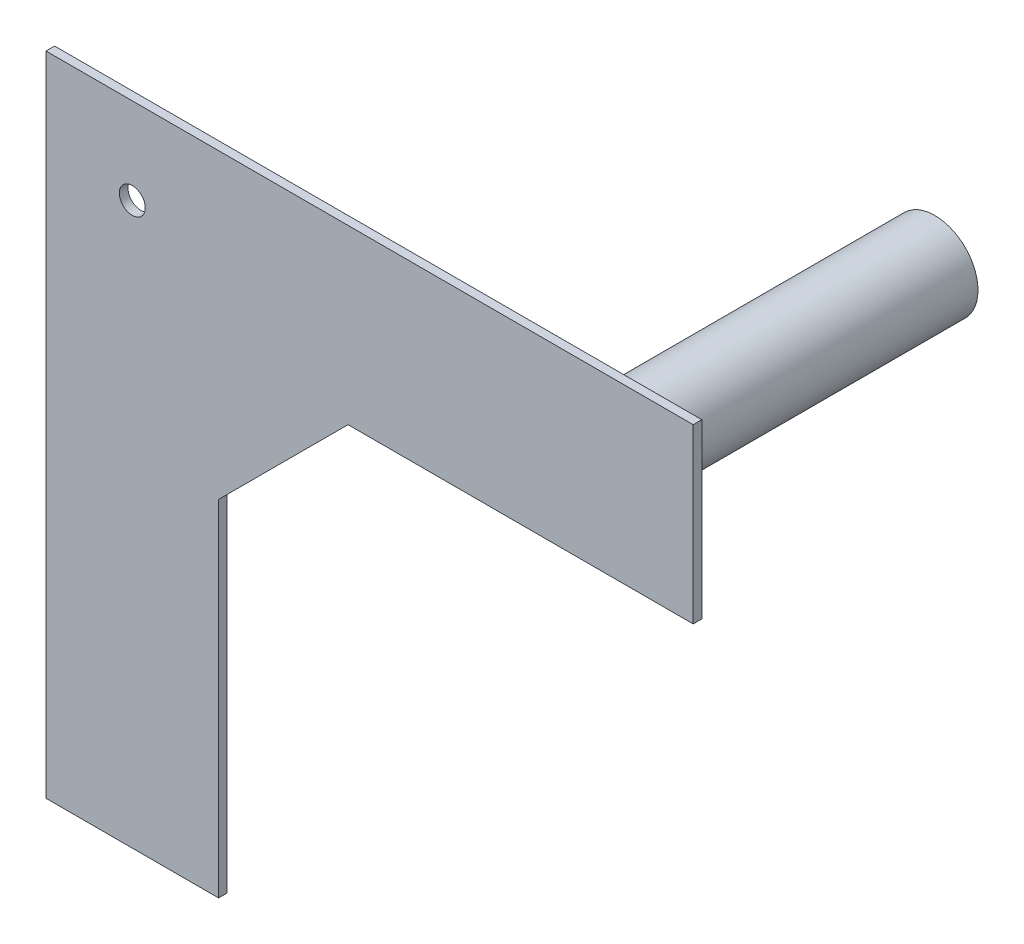
ISO-10303-21;
HEADER;
FILE_DESCRIPTION(('STEP AP214'),'2;1');
FILE_NAME('part.step','',(''),(''),'','','');
FILE_SCHEMA(('AUTOMOTIVE_DESIGN { 1 0 10303 214 1 1 1 1 }'));
ENDSEC;
DATA;
#1=APPLICATION_CONTEXT('core data for automotive mechanical design processes');
#2=APPLICATION_PROTOCOL_DEFINITION('international standard','automotive_design',2000,#1);
#3=PRODUCT_CONTEXT('',#1,'mechanical');
#4=PRODUCT('Part','Part','',(#3));
#5=PRODUCT_RELATED_PRODUCT_CATEGORY('part','',(#4));
#6=PRODUCT_DEFINITION_FORMATION('','',#4);
#7=PRODUCT_DEFINITION_CONTEXT('part definition',#1,'design');
#8=PRODUCT_DEFINITION('design','',#6,#7);
#9=PRODUCT_DEFINITION_SHAPE('','',#8);
#10=(LENGTH_UNIT() NAMED_UNIT(*) SI_UNIT(.MILLI.,.METRE.));
#11=(NAMED_UNIT(*) PLANE_ANGLE_UNIT() SI_UNIT($,.RADIAN.));
#12=(NAMED_UNIT(*) SI_UNIT($,.STERADIAN.) SOLID_ANGLE_UNIT());
#13=UNCERTAINTY_MEASURE_WITH_UNIT(LENGTH_MEASURE(1.E-05),#10,'distance_accuracy_value','');
#14=(GEOMETRIC_REPRESENTATION_CONTEXT(3) GLOBAL_UNCERTAINTY_ASSIGNED_CONTEXT((#13)) GLOBAL_UNIT_ASSIGNED_CONTEXT((#10,
#11,#12)) REPRESENTATION_CONTEXT('',''));
#15=CARTESIAN_POINT('',(0.,0.,0.));
#16=DIRECTION('',(0.,0.,1.));
#17=DIRECTION('',(1.,0.,0.));
#18=AXIS2_PLACEMENT_3D('',#15,#16,#17);
#19=CARTESIAN_POINT('',(-20.,35.,1.));
#20=DIRECTION('',(0.,-1.,0.));
#21=DIRECTION('',(1.,0.,0.));
#22=AXIS2_PLACEMENT_3D('',#19,#20,#21);
#23=PLANE('',#22);
#24=DIRECTION('',(-1.,0.,0.));
#25=VECTOR('',#24,1.);
#26=CARTESIAN_POINT('',(-20.,35.,0.));
#27=LINE('',#26,#25);
#28=CARTESIAN_POINT('',(55.,35.,0.));
#29=VERTEX_POINT('',#28);
#30=CARTESIAN_POINT('',(-20.,35.,0.));
#31=VERTEX_POINT('',#30);
#32=EDGE_CURVE('E124',#29,#31,#27,.T.);
#33=ORIENTED_EDGE('',*,*,#32,.T.);
#34=DIRECTION('',(0.,0.,-1.));
#35=VECTOR('',#34,1.);
#36=CARTESIAN_POINT('',(-20.,35.,1.));
#37=LINE('',#36,#35);
#38=CARTESIAN_POINT('',(-20.,35.,1.));
#39=VERTEX_POINT('',#38);
#40=EDGE_CURVE('E41',#39,#31,#37,.T.);
#41=ORIENTED_EDGE('',*,*,#40,.F.);
#42=DIRECTION('',(-1.,0.,0.));
#43=VECTOR('',#42,1.);
#44=CARTESIAN_POINT('',(-20.,35.,1.));
#45=LINE('',#44,#43);
#46=CARTESIAN_POINT('',(55.,35.,1.));
#47=VERTEX_POINT('',#46);
#48=EDGE_CURVE('E137',#47,#39,#45,.T.);
#49=ORIENTED_EDGE('',*,*,#48,.F.);
#50=DIRECTION('',(0.,0.,-1.));
#51=VECTOR('',#50,1.);
#52=CARTESIAN_POINT('',(55.,35.,1.));
#53=LINE('',#52,#51);
#54=EDGE_CURVE('E120',#47,#29,#53,.T.);
#55=ORIENTED_EDGE('',*,*,#54,.T.);
#56=EDGE_LOOP('',(#33,#41,#49,#55));
#57=FACE_BOUND('',#56,.T.);
#58=ADVANCED_FACE('F33',(#57),#23,.F.);
#59=CARTESIAN_POINT('',(-20.,35.,1.));
#60=DIRECTION('',(1.,0.,0.));
#61=DIRECTION('',(0.,1.,0.));
#62=AXIS2_PLACEMENT_3D('',#59,#60,#61);
#63=PLANE('',#62);
#64=DIRECTION('',(0.,-1.,0.));
#65=VECTOR('',#64,1.);
#66=CARTESIAN_POINT('',(-20.,35.,0.));
#67=LINE('',#66,#65);
#68=CARTESIAN_POINT('',(-20.,-40.,0.));
#69=VERTEX_POINT('',#68);
#70=EDGE_CURVE('E127',#31,#69,#67,.T.);
#71=ORIENTED_EDGE('',*,*,#70,.T.);
#72=DIRECTION('',(0.,0.,-1.));
#73=VECTOR('',#72,1.);
#74=CARTESIAN_POINT('',(-20.,-40.,1.));
#75=LINE('',#74,#73);
#76=CARTESIAN_POINT('',(-20.,-40.,1.));
#77=VERTEX_POINT('',#76);
#78=EDGE_CURVE('E144',#77,#69,#75,.T.);
#79=ORIENTED_EDGE('',*,*,#78,.F.);
#80=DIRECTION('',(0.,-1.,0.));
#81=VECTOR('',#80,1.);
#82=CARTESIAN_POINT('',(-20.,35.,1.));
#83=LINE('',#82,#81);
#84=EDGE_CURVE('E90',#39,#77,#83,.T.);
#85=ORIENTED_EDGE('',*,*,#84,.F.);
#86=ORIENTED_EDGE('',*,*,#40,.T.);
#87=EDGE_LOOP('',(#71,#79,#85,#86));
#88=FACE_BOUND('',#87,.T.);
#89=ADVANCED_FACE('F147',(#88),#63,.F.);
#90=CARTESIAN_POINT('',(-20.,-40.,1.));
#91=DIRECTION('',(0.,1.,0.));
#92=DIRECTION('',(0.,0.,1.));
#93=AXIS2_PLACEMENT_3D('',#90,#91,#92);
#94=PLANE('',#93);
#95=DIRECTION('',(1.,0.,0.));
#96=VECTOR('',#95,1.);
#97=CARTESIAN_POINT('',(-20.,-40.,0.));
#98=LINE('',#97,#96);
#99=CARTESIAN_POINT('',(0.,-40.,0.));
#100=VERTEX_POINT('',#99);
#101=EDGE_CURVE('E130',#69,#100,#98,.T.);
#102=ORIENTED_EDGE('',*,*,#101,.T.);
#103=DIRECTION('',(0.,0.,-1.));
#104=VECTOR('',#103,1.);
#105=CARTESIAN_POINT('',(0.,-40.,1.));
#106=LINE('',#105,#104);
#107=CARTESIAN_POINT('',(0.,-40.,1.));
#108=VERTEX_POINT('',#107);
#109=EDGE_CURVE('E141',#108,#100,#106,.T.);
#110=ORIENTED_EDGE('',*,*,#109,.F.);
#111=DIRECTION('',(1.,0.,0.));
#112=VECTOR('',#111,1.);
#113=CARTESIAN_POINT('',(-20.,-40.,1.));
#114=LINE('',#113,#112);
#115=EDGE_CURVE('E161',#77,#108,#114,.T.);
#116=ORIENTED_EDGE('',*,*,#115,.F.);
#117=ORIENTED_EDGE('',*,*,#78,.T.);
#118=EDGE_LOOP('',(#102,#110,#116,#117));
#119=FACE_BOUND('',#118,.T.);
#120=ADVANCED_FACE('F157',(#119),#94,.F.);
#121=CARTESIAN_POINT('',(0.,-40.,1.));
#122=DIRECTION('',(-1.,0.,0.));
#123=DIRECTION('',(0.,0.,1.));
#124=AXIS2_PLACEMENT_3D('',#121,#122,#123);
#125=PLANE('',#124);
#126=DIRECTION('',(0.,1.,0.));
#127=VECTOR('',#126,1.);
#128=CARTESIAN_POINT('',(0.,-40.,0.));
#129=LINE('',#128,#127);
#130=CARTESIAN_POINT('',(0.,0.,0.));
#131=VERTEX_POINT('',#130);
#132=EDGE_CURVE('E132',#100,#131,#129,.T.);
#133=ORIENTED_EDGE('',*,*,#132,.T.);
#134=DIRECTION('',(0.,0.,-1.));
#135=VECTOR('',#134,1.);
#136=CARTESIAN_POINT('',(0.,0.,1.));
#137=LINE('',#136,#135);
#138=CARTESIAN_POINT('',(0.,0.,1.));
#139=VERTEX_POINT('',#138);
#140=EDGE_CURVE('E115',#139,#131,#137,.T.);
#141=ORIENTED_EDGE('',*,*,#140,.F.);
#142=DIRECTION('',(0.,1.,0.));
#143=VECTOR('',#142,1.);
#144=CARTESIAN_POINT('',(0.,-40.,1.));
#145=LINE('',#144,#143);
#146=EDGE_CURVE('E106',#108,#139,#145,.T.);
#147=ORIENTED_EDGE('',*,*,#146,.F.);
#148=ORIENTED_EDGE('',*,*,#109,.T.);
#149=EDGE_LOOP('',(#133,#141,#147,#148));
#150=FACE_BOUND('',#149,.T.);
#151=ADVANCED_FACE('F160',(#150),#125,.F.);
#152=CARTESIAN_POINT('',(15.,15.,1.));
#153=DIRECTION('',(-0.707106781186548,0.707106781186547,0.));
#154=DIRECTION('',(-0.707106781186547,-0.707106781186548,0.));
#155=AXIS2_PLACEMENT_3D('',#152,#153,#154);
#156=PLANE('',#155);
#157=DIRECTION('',(0.707106781186547,0.707106781186548,0.));
#158=VECTOR('',#157,1.);
#159=CARTESIAN_POINT('',(15.,15.,0.));
#160=LINE('',#159,#158);
#161=CARTESIAN_POINT('',(15.,15.,0.));
#162=VERTEX_POINT('',#161);
#163=EDGE_CURVE('E114',#131,#162,#160,.T.);
#164=ORIENTED_EDGE('',*,*,#163,.T.);
#165=DIRECTION('',(0.,0.,-1.));
#166=VECTOR('',#165,1.);
#167=CARTESIAN_POINT('',(15.,15.,1.));
#168=LINE('',#167,#166);
#169=CARTESIAN_POINT('',(15.,15.,1.));
#170=VERTEX_POINT('',#169);
#171=EDGE_CURVE('E111',#170,#162,#168,.T.);
#172=ORIENTED_EDGE('',*,*,#171,.F.);
#173=DIRECTION('',(0.707106781186547,0.707106781186548,0.));
#174=VECTOR('',#173,1.);
#175=CARTESIAN_POINT('',(15.,15.,1.));
#176=LINE('',#175,#174);
#177=EDGE_CURVE('E100',#139,#170,#176,.T.);
#178=ORIENTED_EDGE('',*,*,#177,.F.);
#179=ORIENTED_EDGE('',*,*,#140,.T.);
#180=EDGE_LOOP('',(#164,#172,#178,#179));
#181=FACE_BOUND('',#180,.T.);
#182=ADVANCED_FACE('F112',(#181),#156,.F.);
#183=CARTESIAN_POINT('',(55.,15.,1.));
#184=DIRECTION('',(0.,1.,0.));
#185=DIRECTION('',(-1.,0.,0.));
#186=AXIS2_PLACEMENT_3D('',#183,#184,#185);
#187=PLANE('',#186);
#188=DIRECTION('',(1.,0.,0.));
#189=VECTOR('',#188,1.);
#190=CARTESIAN_POINT('',(55.,15.,0.));
#191=LINE('',#190,#189);
#192=CARTESIAN_POINT('',(55.,15.,0.));
#193=VERTEX_POINT('',#192);
#194=EDGE_CURVE('E75',#162,#193,#191,.T.);
#195=ORIENTED_EDGE('',*,*,#194,.T.);
#196=DIRECTION('',(0.,0.,-1.));
#197=VECTOR('',#196,1.);
#198=CARTESIAN_POINT('',(55.,15.,1.));
#199=LINE('',#198,#197);
#200=CARTESIAN_POINT('',(55.,15.,1.));
#201=VERTEX_POINT('',#200);
#202=EDGE_CURVE('E116',#201,#193,#199,.T.);
#203=ORIENTED_EDGE('',*,*,#202,.F.);
#204=DIRECTION('',(1.,0.,0.));
#205=VECTOR('',#204,1.);
#206=CARTESIAN_POINT('',(55.,15.,1.));
#207=LINE('',#206,#205);
#208=EDGE_CURVE('E104',#170,#201,#207,.T.);
#209=ORIENTED_EDGE('',*,*,#208,.F.);
#210=ORIENTED_EDGE('',*,*,#171,.T.);
#211=EDGE_LOOP('',(#195,#203,#209,#210));
#212=FACE_BOUND('',#211,.T.);
#213=ADVANCED_FACE('F118',(#212),#187,.F.);
#214=CARTESIAN_POINT('',(55.,35.,1.));
#215=DIRECTION('',(-1.,0.,0.));
#216=DIRECTION('',(0.,-1.,0.));
#217=AXIS2_PLACEMENT_3D('',#214,#215,#216);
#218=PLANE('',#217);
#219=DIRECTION('',(0.,1.,0.));
#220=VECTOR('',#219,1.);
#221=CARTESIAN_POINT('',(55.,35.,0.));
#222=LINE('',#221,#220);
#223=EDGE_CURVE('E81',#193,#29,#222,.T.);
#224=ORIENTED_EDGE('',*,*,#223,.T.);
#225=ORIENTED_EDGE('',*,*,#54,.F.);
#226=DIRECTION('',(0.,1.,0.));
#227=VECTOR('',#226,1.);
#228=CARTESIAN_POINT('',(55.,35.,1.));
#229=LINE('',#228,#227);
#230=EDGE_CURVE('E49',#201,#47,#229,.T.);
#231=ORIENTED_EDGE('',*,*,#230,.F.);
#232=ORIENTED_EDGE('',*,*,#202,.T.);
#233=EDGE_LOOP('',(#224,#225,#231,#232));
#234=FACE_BOUND('',#233,.T.);
#235=ADVANCED_FACE('F201',(#234),#218,.F.);
#236=CARTESIAN_POINT('',(0.,0.,1.));
#237=DIRECTION('',(0.,0.,-1.));
#238=DIRECTION('',(-1.,0.,0.));
#239=AXIS2_PLACEMENT_3D('',#236,#237,#238);
#240=PLANE('',#239);
#241=CARTESIAN_POINT('',(-10.,25.0001495626222,1.));
#242=DIRECTION('',(0.,0.,1.));
#243=DIRECTION('',(1.,0.,0.));
#244=AXIS2_PLACEMENT_3D('',#241,#242,#243);
#245=CIRCLE('',#244,1.5);
#246=CARTESIAN_POINT('',(-8.5,25.0001495626222,1.));
#247=VERTEX_POINT('',#246);
#248=EDGE_CURVE('E166',#247,#247,#245,.T.);
#249=ORIENTED_EDGE('',*,*,#248,.F.);
#250=EDGE_LOOP('',(#249));
#251=FACE_BOUND('',#250,.T.);
#252=ORIENTED_EDGE('',*,*,#48,.T.);
#253=ORIENTED_EDGE('',*,*,#84,.T.);
#254=ORIENTED_EDGE('',*,*,#115,.T.);
#255=ORIENTED_EDGE('',*,*,#146,.T.);
#256=ORIENTED_EDGE('',*,*,#177,.T.);
#257=ORIENTED_EDGE('',*,*,#208,.T.);
#258=ORIENTED_EDGE('',*,*,#230,.T.);
#259=EDGE_LOOP('',(#252,#253,#254,#255,#256,#257,#258));
#260=FACE_BOUND('',#259,.T.);
#261=ADVANCED_FACE('F102',(#251,#260),#240,.F.);
#262=CARTESIAN_POINT('',(0.,0.,0.));
#263=DIRECTION('',(0.,0.,-1.));
#264=DIRECTION('',(-1.,0.,0.));
#265=AXIS2_PLACEMENT_3D('',#262,#263,#264);
#266=PLANE('',#265);
#267=CARTESIAN_POINT('',(43.0070081469509,25.,0.));
#268=DIRECTION('',(0.,0.,-1.));
#269=DIRECTION('',(-1.,0.,0.));
#270=AXIS2_PLACEMENT_3D('',#267,#268,#269);
#271=CIRCLE('',#270,5.);
#272=CARTESIAN_POINT('',(38.0070081469509,25.,0.));
#273=VERTEX_POINT('',#272);
#274=EDGE_CURVE('E11',#273,#273,#271,.T.);
#275=ORIENTED_EDGE('',*,*,#274,.F.);
#276=EDGE_LOOP('',(#275));
#277=FACE_BOUND('',#276,.T.);
#278=CARTESIAN_POINT('',(-10.,25.0001495626222,0.));
#279=DIRECTION('',(0.,0.,1.));
#280=DIRECTION('',(1.,0.,0.));
#281=AXIS2_PLACEMENT_3D('',#278,#279,#280);
#282=CIRCLE('',#281,1.5);
#283=CARTESIAN_POINT('',(-8.5,25.0001495626222,0.));
#284=VERTEX_POINT('',#283);
#285=EDGE_CURVE('E128',#284,#284,#282,.T.);
#286=ORIENTED_EDGE('',*,*,#285,.T.);
#287=EDGE_LOOP('',(#286));
#288=FACE_BOUND('',#287,.T.);
#289=ORIENTED_EDGE('',*,*,#32,.F.);
#290=ORIENTED_EDGE('',*,*,#223,.F.);
#291=ORIENTED_EDGE('',*,*,#194,.F.);
#292=ORIENTED_EDGE('',*,*,#163,.F.);
#293=ORIENTED_EDGE('',*,*,#132,.F.);
#294=ORIENTED_EDGE('',*,*,#101,.F.);
#295=ORIENTED_EDGE('',*,*,#70,.F.);
#296=EDGE_LOOP('',(#289,#290,#291,#292,#293,#294,#295));
#297=FACE_BOUND('',#296,.T.);
#298=ADVANCED_FACE('F152',(#277,#288,#297),#266,.T.);
#299=CARTESIAN_POINT('',(-10.,25.0001495626222,0.));
#300=DIRECTION('',(0.,0.,1.));
#301=DIRECTION('',(1.,0.,0.));
#302=AXIS2_PLACEMENT_3D('',#299,#300,#301);
#303=CYLINDRICAL_SURFACE('',#302,1.5);
#304=ORIENTED_EDGE('',*,*,#285,.F.);
#305=EDGE_LOOP('',(#304));
#306=FACE_BOUND('',#305,.T.);
#307=ORIENTED_EDGE('',*,*,#248,.T.);
#308=EDGE_LOOP('',(#307));
#309=FACE_BOUND('',#308,.T.);
#310=ADVANCED_FACE('F183',(#306,#309),#303,.F.);
#311=CARTESIAN_POINT('',(43.0070081469509,25.,-39.));
#312=DIRECTION('',(0.,0.,1.));
#313=DIRECTION('',(1.,0.,0.));
#314=AXIS2_PLACEMENT_3D('',#311,#312,#313);
#315=CYLINDRICAL_SURFACE('',#314,5.);
#316=ORIENTED_EDGE('',*,*,#274,.T.);
#317=EDGE_LOOP('',(#316));
#318=FACE_BOUND('',#317,.T.);
#319=CARTESIAN_POINT('',(43.0070081469509,25.,-39.));
#320=DIRECTION('',(0.,0.,1.));
#321=DIRECTION('',(1.,0.,0.));
#322=AXIS2_PLACEMENT_3D('',#319,#320,#321);
#323=CIRCLE('',#322,5.);
#324=CARTESIAN_POINT('',(48.0070081469509,25.,-39.));
#325=VERTEX_POINT('',#324);
#326=EDGE_CURVE('E169',#325,#325,#323,.T.);
#327=ORIENTED_EDGE('',*,*,#326,.T.);
#328=EDGE_LOOP('',(#327));
#329=FACE_BOUND('',#328,.T.);
#330=ADVANCED_FACE('F175',(#318,#329),#315,.T.);
#331=CARTESIAN_POINT('',(43.0070081469509,25.,-39.));
#332=DIRECTION('',(0.,0.,1.));
#333=DIRECTION('',(1.,0.,0.));
#334=AXIS2_PLACEMENT_3D('',#331,#332,#333);
#335=PLANE('',#334);
#336=ORIENTED_EDGE('',*,*,#326,.F.);
#337=EDGE_LOOP('',(#336));
#338=FACE_BOUND('',#337,.T.);
#339=ADVANCED_FACE('F177',(#338),#335,.F.);
#340=CLOSED_SHELL('',(#58,#89,#120,#151,#182,#213,#235,#261,#298,#310,#330,#339));
#341=MANIFOLD_SOLID_BREP('B2',#340);
#342=ADVANCED_BREP_SHAPE_REPRESENTATION('',(#18,#341),#14);
#343=SHAPE_DEFINITION_REPRESENTATION(#9,#342);
ENDSEC;
END-ISO-10303-21;
